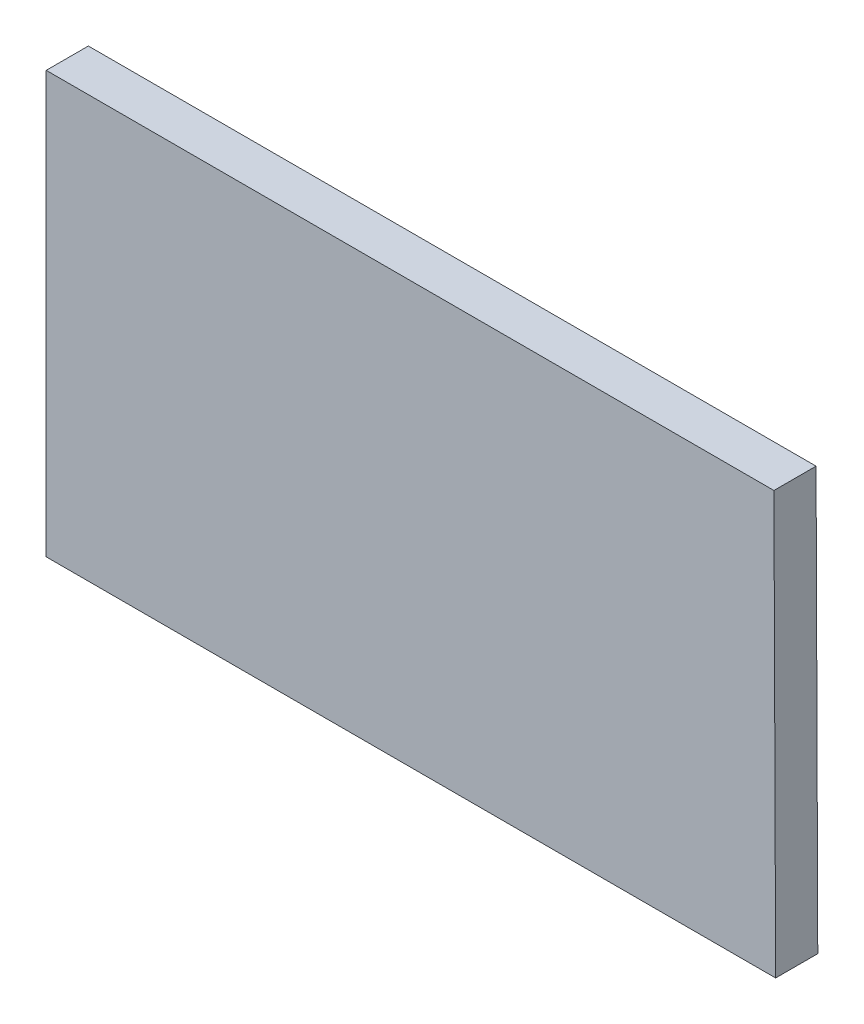
ISO-10303-21;
HEADER;
FILE_DESCRIPTION(('STEP AP214'),'2;1');
FILE_NAME('part.step','',(''),(''),'','','');
FILE_SCHEMA(('AUTOMOTIVE_DESIGN { 1 0 10303 214 1 1 1 1 }'));
ENDSEC;
DATA;
#1=APPLICATION_CONTEXT('core data for automotive mechanical design processes');
#2=APPLICATION_PROTOCOL_DEFINITION('international standard','automotive_design',2000,#1);
#3=PRODUCT_CONTEXT('',#1,'mechanical');
#4=PRODUCT('Part','Part','',(#3));
#5=PRODUCT_RELATED_PRODUCT_CATEGORY('part','',(#4));
#6=PRODUCT_DEFINITION_FORMATION('','',#4);
#7=PRODUCT_DEFINITION_CONTEXT('part definition',#1,'design');
#8=PRODUCT_DEFINITION('design','',#6,#7);
#9=PRODUCT_DEFINITION_SHAPE('','',#8);
#10=(LENGTH_UNIT() NAMED_UNIT(*) SI_UNIT(.MILLI.,.METRE.));
#11=(NAMED_UNIT(*) PLANE_ANGLE_UNIT() SI_UNIT($,.RADIAN.));
#12=(NAMED_UNIT(*) SI_UNIT($,.STERADIAN.) SOLID_ANGLE_UNIT());
#13=UNCERTAINTY_MEASURE_WITH_UNIT(LENGTH_MEASURE(1.E-05),#10,'distance_accuracy_value','');
#14=(GEOMETRIC_REPRESENTATION_CONTEXT(3) GLOBAL_UNCERTAINTY_ASSIGNED_CONTEXT((#13)) GLOBAL_UNIT_ASSIGNED_CONTEXT((#10,
#11,#12)) REPRESENTATION_CONTEXT('',''));
#15=CARTESIAN_POINT('',(0.,0.,0.));
#16=DIRECTION('',(0.,0.,1.));
#17=DIRECTION('',(1.,0.,0.));
#18=AXIS2_PLACEMENT_3D('',#15,#16,#17);
#19=CARTESIAN_POINT('',(-17.3115998311562,10.,2.));
#20=DIRECTION('',(1.,0.,0.));
#21=DIRECTION('',(0.,0.,-1.));
#22=AXIS2_PLACEMENT_3D('',#19,#20,#21);
#23=PLANE('',#22);
#24=DIRECTION('',(0.,-1.,0.));
#25=VECTOR('',#24,1.);
#26=CARTESIAN_POINT('',(-17.3115998311562,10.,0.));
#27=LINE('',#26,#25);
#28=CARTESIAN_POINT('',(-17.3115998311562,10.,0.));
#29=VERTEX_POINT('',#28);
#30=CARTESIAN_POINT('',(-17.3115998311562,-10.,0.));
#31=VERTEX_POINT('',#30);
#32=EDGE_CURVE('E99',#29,#31,#27,.T.);
#33=ORIENTED_EDGE('',*,*,#32,.T.);
#34=DIRECTION('',(0.,0.,-1.));
#35=VECTOR('',#34,1.);
#36=CARTESIAN_POINT('',(-17.3115998311562,-10.,2.));
#37=LINE('',#36,#35);
#38=CARTESIAN_POINT('',(-17.3115998311562,-10.,2.));
#39=VERTEX_POINT('',#38);
#40=EDGE_CURVE('E11',#39,#31,#37,.T.);
#41=ORIENTED_EDGE('',*,*,#40,.F.);
#42=DIRECTION('',(0.,-1.,0.));
#43=VECTOR('',#42,1.);
#44=CARTESIAN_POINT('',(-17.3115998311562,10.,2.));
#45=LINE('',#44,#43);
#46=CARTESIAN_POINT('',(-17.3115998311562,10.,2.));
#47=VERTEX_POINT('',#46);
#48=EDGE_CURVE('E87',#47,#39,#45,.T.);
#49=ORIENTED_EDGE('',*,*,#48,.F.);
#50=DIRECTION('',(0.,0.,-1.));
#51=VECTOR('',#50,1.);
#52=CARTESIAN_POINT('',(-17.3115998311562,10.,2.));
#53=LINE('',#52,#51);
#54=EDGE_CURVE('E95',#47,#29,#53,.T.);
#55=ORIENTED_EDGE('',*,*,#54,.T.);
#56=EDGE_LOOP('',(#33,#41,#49,#55));
#57=FACE_BOUND('',#56,.T.);
#58=ADVANCED_FACE('F36',(#57),#23,.F.);
#59=CARTESIAN_POINT('',(-17.3115998311562,-10.,2.));
#60=DIRECTION('',(0.,1.,0.));
#61=DIRECTION('',(0.,0.,1.));
#62=AXIS2_PLACEMENT_3D('',#59,#60,#61);
#63=PLANE('',#62);
#64=DIRECTION('',(1.,0.,0.));
#65=VECTOR('',#64,1.);
#66=CARTESIAN_POINT('',(-17.3115998311562,-10.,0.));
#67=LINE('',#66,#65);
#68=CARTESIAN_POINT('',(17.3115998311562,-10.,0.));
#69=VERTEX_POINT('',#68);
#70=EDGE_CURVE('E91',#31,#69,#67,.T.);
#71=ORIENTED_EDGE('',*,*,#70,.T.);
#72=DIRECTION('',(0.,0.,-1.));
#73=VECTOR('',#72,1.);
#74=CARTESIAN_POINT('',(17.3115998311562,-10.,2.));
#75=LINE('',#74,#73);
#76=CARTESIAN_POINT('',(17.3115998311562,-10.,2.));
#77=VERTEX_POINT('',#76);
#78=EDGE_CURVE('E44',#77,#69,#75,.T.);
#79=ORIENTED_EDGE('',*,*,#78,.F.);
#80=DIRECTION('',(1.,0.,0.));
#81=VECTOR('',#80,1.);
#82=CARTESIAN_POINT('',(-17.3115998311562,-10.,2.));
#83=LINE('',#82,#81);
#84=EDGE_CURVE('E82',#39,#77,#83,.T.);
#85=ORIENTED_EDGE('',*,*,#84,.F.);
#86=ORIENTED_EDGE('',*,*,#40,.T.);
#87=EDGE_LOOP('',(#71,#79,#85,#86));
#88=FACE_BOUND('',#87,.T.);
#89=ADVANCED_FACE('F90',(#88),#63,.F.);
#90=CARTESIAN_POINT('',(17.3115998311562,-10.,2.));
#91=DIRECTION('',(-0.999991728264343,-0.00406735822028056,0.));
#92=DIRECTION('',(0.00406735822028057,-0.999991728264343,0.));
#93=AXIS2_PLACEMENT_3D('',#90,#91,#92);
#94=PLANE('',#93);
#95=DIRECTION('',(-0.00406735822028056,0.999991728264343,0.));
#96=VECTOR('',#95,1.);
#97=CARTESIAN_POINT('',(17.3115998311562,-10.,0.));
#98=LINE('',#97,#96);
#99=CARTESIAN_POINT('',(17.2302519938628,10.,0.));
#100=VERTEX_POINT('',#99);
#101=EDGE_CURVE('E69',#69,#100,#98,.T.);
#102=ORIENTED_EDGE('',*,*,#101,.T.);
#103=DIRECTION('',(0.,0.,-1.));
#104=VECTOR('',#103,1.);
#105=CARTESIAN_POINT('',(17.2302519938628,10.,2.));
#106=LINE('',#105,#104);
#107=CARTESIAN_POINT('',(17.2302519938628,10.,2.));
#108=VERTEX_POINT('',#107);
#109=EDGE_CURVE('E92',#108,#100,#106,.T.);
#110=ORIENTED_EDGE('',*,*,#109,.F.);
#111=DIRECTION('',(-0.00406735822028056,0.999991728264343,0.));
#112=VECTOR('',#111,1.);
#113=CARTESIAN_POINT('',(17.3115998311562,-10.,2.));
#114=LINE('',#113,#112);
#115=EDGE_CURVE('E85',#77,#108,#114,.T.);
#116=ORIENTED_EDGE('',*,*,#115,.F.);
#117=ORIENTED_EDGE('',*,*,#78,.T.);
#118=EDGE_LOOP('',(#102,#110,#116,#117));
#119=FACE_BOUND('',#118,.T.);
#120=ADVANCED_FACE('F93',(#119),#94,.F.);
#121=CARTESIAN_POINT('',(17.2302519938628,10.,2.));
#122=DIRECTION('',(0.,-1.,0.));
#123=DIRECTION('',(0.,0.,-1.));
#124=AXIS2_PLACEMENT_3D('',#121,#122,#123);
#125=PLANE('',#124);
#126=DIRECTION('',(-1.,0.,0.));
#127=VECTOR('',#126,1.);
#128=CARTESIAN_POINT('',(17.2302519938628,10.,0.));
#129=LINE('',#128,#127);
#130=EDGE_CURVE('E75',#100,#29,#129,.T.);
#131=ORIENTED_EDGE('',*,*,#130,.T.);
#132=ORIENTED_EDGE('',*,*,#54,.F.);
#133=DIRECTION('',(-1.,0.,0.));
#134=VECTOR('',#133,1.);
#135=CARTESIAN_POINT('',(17.2302519938628,10.,2.));
#136=LINE('',#135,#134);
#137=EDGE_CURVE('E52',#108,#47,#136,.T.);
#138=ORIENTED_EDGE('',*,*,#137,.F.);
#139=ORIENTED_EDGE('',*,*,#109,.T.);
#140=EDGE_LOOP('',(#131,#132,#138,#139));
#141=FACE_BOUND('',#140,.T.);
#142=ADVANCED_FACE('F106',(#141),#125,.F.);
#143=CARTESIAN_POINT('',(0.,0.,2.));
#144=DIRECTION('',(0.,0.,1.));
#145=DIRECTION('',(1.,0.,0.));
#146=AXIS2_PLACEMENT_3D('',#143,#144,#145);
#147=PLANE('',#146);
#148=ORIENTED_EDGE('',*,*,#48,.T.);
#149=ORIENTED_EDGE('',*,*,#84,.T.);
#150=ORIENTED_EDGE('',*,*,#115,.T.);
#151=ORIENTED_EDGE('',*,*,#137,.T.);
#152=EDGE_LOOP('',(#148,#149,#150,#151));
#153=FACE_BOUND('',#152,.T.);
#154=ADVANCED_FACE('F83',(#153),#147,.T.);
#155=CARTESIAN_POINT('',(0.,0.,0.));
#156=DIRECTION('',(0.,0.,1.));
#157=DIRECTION('',(1.,0.,0.));
#158=AXIS2_PLACEMENT_3D('',#155,#156,#157);
#159=PLANE('',#158);
#160=ORIENTED_EDGE('',*,*,#32,.F.);
#161=ORIENTED_EDGE('',*,*,#130,.F.);
#162=ORIENTED_EDGE('',*,*,#101,.F.);
#163=ORIENTED_EDGE('',*,*,#70,.F.);
#164=EDGE_LOOP('',(#160,#161,#162,#163));
#165=FACE_BOUND('',#164,.T.);
#166=ADVANCED_FACE('F109',(#165),#159,.F.);
#167=CLOSED_SHELL('',(#58,#89,#120,#142,#154,#166));
#168=MANIFOLD_SOLID_BREP('B2',#167);
#169=ADVANCED_BREP_SHAPE_REPRESENTATION('',(#18,#168),#14);
#170=SHAPE_DEFINITION_REPRESENTATION(#9,#169);
ENDSEC;
END-ISO-10303-21;
